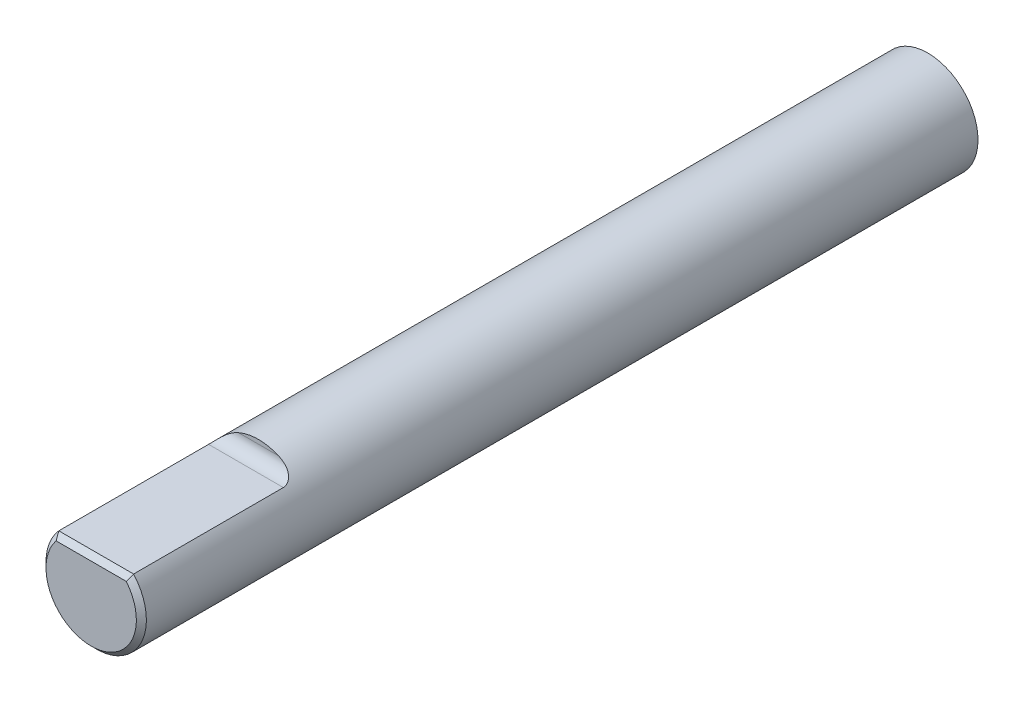
ISO-10303-21;
HEADER;
FILE_DESCRIPTION(('STEP AP214'),'2;1');
FILE_NAME('part.step','',(''),(''),'','','');
FILE_SCHEMA(('AUTOMOTIVE_DESIGN { 1 0 10303 214 1 1 1 1 }'));
ENDSEC;
DATA;
#1=APPLICATION_CONTEXT('core data for automotive mechanical design processes');
#2=APPLICATION_PROTOCOL_DEFINITION('international standard','automotive_design',2000,#1);
#3=PRODUCT_CONTEXT('',#1,'mechanical');
#4=PRODUCT('Part','Part','',(#3));
#5=PRODUCT_RELATED_PRODUCT_CATEGORY('part','',(#4));
#6=PRODUCT_DEFINITION_FORMATION('','',#4);
#7=PRODUCT_DEFINITION_CONTEXT('part definition',#1,'design');
#8=PRODUCT_DEFINITION('design','',#6,#7);
#9=PRODUCT_DEFINITION_SHAPE('','',#8);
#10=(LENGTH_UNIT() NAMED_UNIT(*) SI_UNIT(.MILLI.,.METRE.));
#11=(NAMED_UNIT(*) PLANE_ANGLE_UNIT() SI_UNIT($,.RADIAN.));
#12=(NAMED_UNIT(*) SI_UNIT($,.STERADIAN.) SOLID_ANGLE_UNIT());
#13=UNCERTAINTY_MEASURE_WITH_UNIT(LENGTH_MEASURE(1.E-05),#10,'distance_accuracy_value','');
#14=(GEOMETRIC_REPRESENTATION_CONTEXT(3) GLOBAL_UNCERTAINTY_ASSIGNED_CONTEXT((#13)) GLOBAL_UNIT_ASSIGNED_CONTEXT((#10,
#11,#12)) REPRESENTATION_CONTEXT('',''));
#15=CARTESIAN_POINT('',(0.,0.,0.));
#16=DIRECTION('',(0.,0.,1.));
#17=DIRECTION('',(1.,0.,0.));
#18=AXIS2_PLACEMENT_3D('',#15,#16,#17);
#19=CARTESIAN_POINT('',(0.,0.,0.));
#20=DIRECTION('',(0.,0.,1.));
#21=DIRECTION('',(1.,0.,0.));
#22=AXIS2_PLACEMENT_3D('',#19,#20,#21);
#23=PLANE('',#22);
#24=CARTESIAN_POINT('',(0.,0.,0.));
#25=DIRECTION('',(0.,0.,1.));
#26=DIRECTION('',(1.,0.,0.));
#27=AXIS2_PLACEMENT_3D('',#24,#25,#26);
#28=CIRCLE('',#27,3.);
#29=CARTESIAN_POINT('',(3.,0.,0.));
#30=VERTEX_POINT('',#29);
#31=EDGE_CURVE('E100',#30,#30,#28,.T.);
#32=ORIENTED_EDGE('',*,*,#31,.F.);
#33=EDGE_LOOP('',(#32));
#34=FACE_BOUND('',#33,.T.);
#35=ADVANCED_FACE('F49',(#34),#23,.F.);
#36=CARTESIAN_POINT('',(0.,0.,50.));
#37=DIRECTION('',(0.,0.,-1.));
#38=DIRECTION('',(-1.,0.,0.));
#39=AXIS2_PLACEMENT_3D('',#36,#37,#38);
#40=CYLINDRICAL_SURFACE('',#39,3.);
#41=CARTESIAN_POINT('',(0.,0.,40.));
#42=DIRECTION('',(0.,0.,-1.));
#43=DIRECTION('',(-1.,0.,0.));
#44=AXIS2_PLACEMENT_3D('',#41,#42,#43);
#45=CIRCLE('',#44,3.);
#46=CARTESIAN_POINT('',(-1.1962169155596,2.75119339395272,40.));
#47=VERTEX_POINT('',#46);
#48=CARTESIAN_POINT('',(1.1962169155596,2.75119339395272,40.));
#49=VERTEX_POINT('',#48);
#50=EDGE_CURVE('E121',#47,#49,#45,.T.);
#51=ORIENTED_EDGE('',*,*,#50,.T.);
#52=CARTESIAN_POINT('',(1.1962169155596,2.75119339395272,40.));
#53=CARTESIAN_POINT('',(1.24222518275668,2.73119562237364,40.0000157686662));
#54=CARTESIAN_POINT('',(1.28775314852904,2.71002144823058,40.0008018134025));
#55=CARTESIAN_POINT('',(1.37776727037018,2.66538559334451,40.0045824511129));
#56=CARTESIAN_POINT('',(1.42224936099584,2.64191638463232,40.0075845391516));
#57=CARTESIAN_POINT('',(1.51043765714947,2.59252221446758,40.0165415293756));
#58=CARTESIAN_POINT('',(1.55412189941072,2.56656543592125,40.022540476256));
#59=CARTESIAN_POINT('',(1.63957441193435,2.51283451712152,40.0383340463397));
#60=CARTESIAN_POINT('',(1.68134556523954,2.48506327558637,40.0481227327533));
#61=CARTESIAN_POINT('',(1.76558957879431,2.42601107912135,40.073343590275));
#62=CARTESIAN_POINT('',(1.80788126934195,2.39462297257402,40.0891430853417));
#63=CARTESIAN_POINT('',(1.8887354569612,2.33137162056295,40.1274180956902));
#64=CARTESIAN_POINT('',(1.92731281549099,2.299510912308,40.1498654042093));
#65=CARTESIAN_POINT('',(1.99326258192928,2.24242245891951,40.1979268222251));
#66=CARTESIAN_POINT('',(2.02140696225381,2.21702393747998,40.2222650343506));
#67=CARTESIAN_POINT('',(2.07364217208428,2.16824374049629,40.2767130342515));
#68=CARTESIAN_POINT('',(2.09773611153661,2.14486052437691,40.3068183556624));
#69=CARTESIAN_POINT('',(2.13656688606444,2.10610561089967,40.3661336702195));
#70=CARTESIAN_POINT('',(2.15221120217089,2.09006777539743,40.3943116255691));
#71=CARTESIAN_POINT('',(2.17979531118679,2.0612837596129,40.4539953879123));
#72=CARTESIAN_POINT('',(2.19173687271898,2.04853600830944,40.4854995964496));
#73=CARTESIAN_POINT('',(2.2104665441801,2.0283018744842,40.5477861979758));
#74=CARTESIAN_POINT('',(2.21765467159571,2.02041282577899,40.5783173593903));
#75=CARTESIAN_POINT('',(2.22842865403309,2.00852537730882,40.6407034744875));
#76=CARTESIAN_POINT('',(2.23202190912701,2.00451898559978,40.6725555675812));
#77=CARTESIAN_POINT('',(2.23459099875873,2.00164913491167,40.7197105640745));
#78=CARTESIAN_POINT('',(2.23500369183549,2.00118645752011,40.7348590184008));
#79=CARTESIAN_POINT('',(2.23500000000006,2.00119339395272,40.75));
#80=B_SPLINE_CURVE_WITH_KNOTS('',3,(#52,#53,#54,#55,#56,#57,#58,#59,#60,#61,#62,#63,#64,#65,#66,
#67,#68,#69,#70,#71,#72,#73,#74,#75,#76,#77,#78,#79),.UNSPECIFIED.,.F.,.F.,(4,2,2,2,2,2,2,2,2,2,
2,2,2,4),(0.,0.15052116479935,0.301553765922747,0.454874437474989,0.607955891176367,
0.772486350302781,0.936328469318561,1.07099221150193,1.20555208129965,1.31311693497122,
1.42063033080397,1.51723241284246,1.6136352270488,1.65906654746432),.UNSPECIFIED.);
#81=CARTESIAN_POINT('',(2.235,2.00119339395272,40.75));
#82=VERTEX_POINT('',#81);
#83=EDGE_CURVE('E63',#49,#82,#80,.T.);
#84=ORIENTED_EDGE('',*,*,#83,.T.);
#85=DIRECTION('',(0.,0.,1.));
#86=VECTOR('',#85,1.);
#87=CARTESIAN_POINT('',(2.235,2.00119339395272,40.));
#88=LINE('',#87,#86);
#89=CARTESIAN_POINT('',(2.235,2.00119339395272,49.7));
#90=VERTEX_POINT('',#89);
#91=EDGE_CURVE('E92',#82,#90,#88,.T.);
#92=ORIENTED_EDGE('',*,*,#91,.T.);
#93=CARTESIAN_POINT('',(0.,0.,49.7));
#94=DIRECTION('',(0.,0.,1.));
#95=DIRECTION('',(1.,0.,0.));
#96=AXIS2_PLACEMENT_3D('',#93,#94,#95);
#97=CIRCLE('',#96,3.);
#98=CARTESIAN_POINT('',(-2.235,2.00119339395272,49.7));
#99=VERTEX_POINT('',#98);
#100=EDGE_CURVE('E97',#90,#99,#97,.F.);
#101=ORIENTED_EDGE('',*,*,#100,.T.);
#102=DIRECTION('',(0.,0.,1.));
#103=VECTOR('',#102,1.);
#104=CARTESIAN_POINT('',(-2.235,2.00119339395272,40.));
#105=LINE('',#104,#103);
#106=CARTESIAN_POINT('',(-2.235,2.00119339395272,40.75));
#107=VERTEX_POINT('',#106);
#108=EDGE_CURVE('E101',#107,#99,#105,.T.);
#109=ORIENTED_EDGE('',*,*,#108,.F.);
#110=CARTESIAN_POINT('',(-2.235,2.00119339395272,40.75));
#111=CARTESIAN_POINT('',(-2.23500023229762,2.00119169655488,40.7331467511058));
#112=CARTESIAN_POINT('',(-2.23449100929527,2.00176198822742,40.7163027767674));
#113=CARTESIAN_POINT('',(-2.23246227737714,2.00402486785633,40.6827584085412));
#114=CARTESIAN_POINT('',(-2.23094318227128,2.00571699612293,40.6660579586802));
#115=CARTESIAN_POINT('',(-2.22490915372257,2.01241574540039,40.6165499591232));
#116=CARTESIAN_POINT('',(-2.21891718398404,2.01904534549297,40.5841178564177));
#117=CARTESIAN_POINT('',(-2.20321570422094,2.03616620568795,40.5213142418413));
#118=CARTESIAN_POINT('',(-2.1935103526999,2.04665314556667,40.4909404695363));
#119=CARTESIAN_POINT('',(-2.17070381549559,2.07082602165594,40.432838319743));
#120=CARTESIAN_POINT('',(-2.15759917947119,2.08451520681456,40.4051126695021));
#121=CARTESIAN_POINT('',(-2.12764760286056,2.11508726256792,40.3514120816877));
#122=CARTESIAN_POINT('',(-2.11064421451943,2.13209716293619,40.3255979279736));
#123=CARTESIAN_POINT('',(-2.07380629003343,2.16794632280461,40.2775349776914));
#124=CARTESIAN_POINT('',(-2.05397070114328,2.18678626170441,40.2552875134392));
#125=CARTESIAN_POINT('',(-1.99985125709621,2.23664934387367,40.2025389747858));
#126=CARTESIAN_POINT('',(-1.96379681074833,2.26847268772597,40.1746040435356));
#127=CARTESIAN_POINT('',(-1.8872306386596,2.33256933602034,40.1264056949451));
#128=CARTESIAN_POINT('',(-1.84670759882408,2.36484359316026,40.1061623554442));
#129=CARTESIAN_POINT('',(-1.73924352591124,2.44574489670816,40.062743741554));
#130=CARTESIAN_POINT('',(-1.66998337199807,2.49365312164833,40.0440288317468));
#131=CARTESIAN_POINT('',(-1.52621314422707,2.58417397900689,40.0173089139636));
#132=CARTESIAN_POINT('',(-1.4516928075089,2.62677578439465,40.0093254875428));
#133=CARTESIAN_POINT('',(-1.34595518937474,2.68132522376805,40.0031073484461));
#134=CARTESIAN_POINT('',(-1.31626142865543,2.69602584206453,40.0018966666259));
#135=CARTESIAN_POINT('',(-1.25652314126657,2.72437816430058,40.0003454010855));
#136=CARTESIAN_POINT('',(-1.22648088463002,2.7380344233419,40.0000008018103));
#137=CARTESIAN_POINT('',(-1.1962169155596,2.75119339395272,40.));
#138=B_SPLINE_CURVE_WITH_KNOTS('',3,(#110,#111,#112,#113,#114,#115,#116,#117,#118,#119,#120,
#121,#122,#123,#124,#125,#126,#127,#128,#129,#130,#131,#132,#133,#134,#135,#136,#137),
.UNSPECIFIED.,.F.,.F.,(4,2,2,2,2,2,2,2,2,2,2,2,2,4),(0.,0.0505244491093715,0.101028207834722,
0.201391437221654,0.301642600292588,0.401995921192308,0.507453729573368,0.612950839772778,
0.778842530583308,0.945164331412119,1.2025259691887,1.46040440375612,1.55985070214039,
1.65883506424196),.UNSPECIFIED.);
#139=EDGE_CURVE('E12',#107,#47,#138,.T.);
#140=ORIENTED_EDGE('',*,*,#139,.T.);
#141=EDGE_LOOP('',(#51,#84,#92,#101,#109,#140));
#142=FACE_BOUND('',#141,.T.);
#143=ORIENTED_EDGE('',*,*,#31,.T.);
#144=EDGE_LOOP('',(#143));
#145=FACE_BOUND('',#144,.T.);
#146=ADVANCED_FACE('F94',(#142,#145),#40,.T.);
#147=CARTESIAN_POINT('',(0.,0.,50.));
#148=DIRECTION('',(0.,0.,1.));
#149=DIRECTION('',(1.,0.,0.));
#150=AXIS2_PLACEMENT_3D('',#147,#148,#149);
#151=PLANE('',#150);
#152=CARTESIAN_POINT('',(0.,0.,50.));
#153=DIRECTION('',(0.,0.,1.));
#154=DIRECTION('',(1.,0.,0.));
#155=AXIS2_PLACEMENT_3D('',#152,#153,#154);
#156=CIRCLE('',#155,2.70000000000001);
#157=CARTESIAN_POINT('',(-2.09664995561303,1.70119339395259,50.));
#158=VERTEX_POINT('',#157);
#159=CARTESIAN_POINT('',(2.09664995561303,1.70119339395259,50.));
#160=VERTEX_POINT('',#159);
#161=EDGE_CURVE('E120',#158,#160,#156,.T.);
#162=ORIENTED_EDGE('',*,*,#161,.T.);
#163=DIRECTION('',(-1.,0.,0.));
#164=VECTOR('',#163,1.);
#165=CARTESIAN_POINT('',(-2.235,1.70119339395273,50.));
#166=LINE('',#165,#164);
#167=EDGE_CURVE('E111',#160,#158,#166,.T.);
#168=ORIENTED_EDGE('',*,*,#167,.T.);
#169=EDGE_LOOP('',(#162,#168));
#170=FACE_BOUND('',#169,.T.);
#171=ADVANCED_FACE('F152',(#170),#151,.T.);
#172=CARTESIAN_POINT('',(0.,0.,40.));
#173=DIRECTION('',(0.,0.,-1.));
#174=DIRECTION('',(-1.,0.,0.));
#175=AXIS2_PLACEMENT_3D('',#172,#173,#174);
#176=PLANE('',#175);
#177=ORIENTED_EDGE('',*,*,#50,.F.);
#178=DIRECTION('',(1.,0.,0.));
#179=VECTOR('',#178,1.);
#180=CARTESIAN_POINT('',(2.235,2.75119339395272,40.));
#181=LINE('',#180,#179);
#182=EDGE_CURVE('E117',#47,#49,#181,.T.);
#183=ORIENTED_EDGE('',*,*,#182,.T.);
#184=EDGE_LOOP('',(#177,#183));
#185=FACE_BOUND('',#184,.T.);
#186=ADVANCED_FACE('F157',(#185),#176,.F.);
#187=CARTESIAN_POINT('',(-2.235,2.00119339395272,40.));
#188=DIRECTION('',(0.,-1.,0.));
#189=DIRECTION('',(0.,0.,-1.));
#190=AXIS2_PLACEMENT_3D('',#187,#188,#189);
#191=PLANE('',#190);
#192=ORIENTED_EDGE('',*,*,#91,.F.);
#193=DIRECTION('',(1.,0.,0.));
#194=VECTOR('',#193,1.);
#195=CARTESIAN_POINT('',(-2.235,2.00119339395272,40.75));
#196=LINE('',#195,#194);
#197=EDGE_CURVE('E76',#82,#107,#196,.F.);
#198=ORIENTED_EDGE('',*,*,#197,.T.);
#199=ORIENTED_EDGE('',*,*,#108,.T.);
#200=DIRECTION('',(1.,0.,0.));
#201=VECTOR('',#200,1.);
#202=CARTESIAN_POINT('',(2.235,2.00119339395272,49.7));
#203=LINE('',#202,#201);
#204=EDGE_CURVE('E109',#99,#90,#203,.T.);
#205=ORIENTED_EDGE('',*,*,#204,.T.);
#206=EDGE_LOOP('',(#192,#198,#199,#205));
#207=FACE_BOUND('',#206,.T.);
#208=ADVANCED_FACE('F119',(#207),#191,.F.);
#209=CARTESIAN_POINT('',(0.,0.,50.));
#210=DIRECTION('',(0.,0.,-1.));
#211=DIRECTION('',(-1.,0.,0.));
#212=AXIS2_PLACEMENT_3D('',#209,#210,#211);
#213=CONICAL_SURFACE('',#212,2.70000000000001,0.785398163397433);
#214=CARTESIAN_POINT('',(2.235,2.00119339395272,49.7));
#215=CARTESIAN_POINT('',(2.21260722808575,1.95103998934096,49.7501534046118));
#216=CARTESIAN_POINT('',(2.18988168559658,1.90096331610078,49.8002300778519));
#217=CARTESIAN_POINT('',(2.14376500568676,1.80096331574282,49.9002300782099));
#218=CARTESIAN_POINT('',(2.12037386671378,1.75103998898297,49.9501534049698));
#219=CARTESIAN_POINT('',(2.09664995561356,1.70119339395265,50.0000000000001));
#220=B_SPLINE_CURVE_WITH_KNOTS('',3,(#214,#215,#216,#217,#218,#219),.UNSPECIFIED.,.F.,.F.,(4,2,
4),(0.,0.223128147447381,0.446256815323012),.UNSPECIFIED.);
#221=EDGE_CURVE('E107',#160,#90,#220,.F.);
#222=ORIENTED_EDGE('',*,*,#221,.F.);
#223=ORIENTED_EDGE('',*,*,#161,.F.);
#224=CARTESIAN_POINT('',(-2.0966499556132,1.70119339395273,50.));
#225=CARTESIAN_POINT('',(-2.12037386671346,1.75103998898304,49.9501534049697));
#226=CARTESIAN_POINT('',(-2.14376500568656,1.80096331574286,49.9002300782099));
#227=CARTESIAN_POINT('',(-2.18988168559678,1.90096331610073,49.800230077852));
#228=CARTESIAN_POINT('',(-2.21260722808623,1.95103998934084,49.7501534046119));
#229=CARTESIAN_POINT('',(-2.23500000000084,2.00119339395252,49.7000000000002));
#230=B_SPLINE_CURVE_WITH_KNOTS('',3,(#224,#225,#226,#227,#228,#229),.UNSPECIFIED.,.F.,.F.,(4,2,
4),(0.,0.22312866787563,0.446256815323008),.UNSPECIFIED.);
#231=EDGE_CURVE('E114',#99,#158,#230,.F.);
#232=ORIENTED_EDGE('',*,*,#231,.F.);
#233=ORIENTED_EDGE('',*,*,#100,.F.);
#234=EDGE_LOOP('',(#222,#223,#232,#233));
#235=FACE_BOUND('',#234,.T.);
#236=ADVANCED_FACE('F116',(#235),#213,.T.);
#237=CARTESIAN_POINT('',(-2.235,2.00119339395272,49.7));
#238=DIRECTION('',(0.,0.707106781186558,0.707106781186537));
#239=DIRECTION('',(-1.,0.,0.));
#240=AXIS2_PLACEMENT_3D('',#237,#238,#239);
#241=PLANE('',#240);
#242=ORIENTED_EDGE('',*,*,#231,.T.);
#243=ORIENTED_EDGE('',*,*,#167,.F.);
#244=ORIENTED_EDGE('',*,*,#221,.T.);
#245=ORIENTED_EDGE('',*,*,#204,.F.);
#246=EDGE_LOOP('',(#242,#243,#244,#245));
#247=FACE_BOUND('',#246,.T.);
#248=ADVANCED_FACE('F108',(#247),#241,.T.);
#249=CARTESIAN_POINT('',(0.,2.75119339395272,40.75));
#250=DIRECTION('',(-1.,0.,0.));
#251=DIRECTION('',(0.,0.,1.));
#252=AXIS2_PLACEMENT_3D('',#249,#250,#251);
#253=CYLINDRICAL_SURFACE('',#252,0.75);
#254=ORIENTED_EDGE('',*,*,#139,.F.);
#255=ORIENTED_EDGE('',*,*,#197,.F.);
#256=ORIENTED_EDGE('',*,*,#83,.F.);
#257=ORIENTED_EDGE('',*,*,#182,.F.);
#258=EDGE_LOOP('',(#254,#255,#256,#257));
#259=FACE_BOUND('',#258,.T.);
#260=ADVANCED_FACE('F51',(#259),#253,.F.);
#261=CLOSED_SHELL('',(#35,#146,#171,#186,#208,#236,#248,#260));
#262=MANIFOLD_SOLID_BREP('B2',#261);
#263=ADVANCED_BREP_SHAPE_REPRESENTATION('',(#18,#262),#14);
#264=SHAPE_DEFINITION_REPRESENTATION(#9,#263);
ENDSEC;
END-ISO-10303-21;
